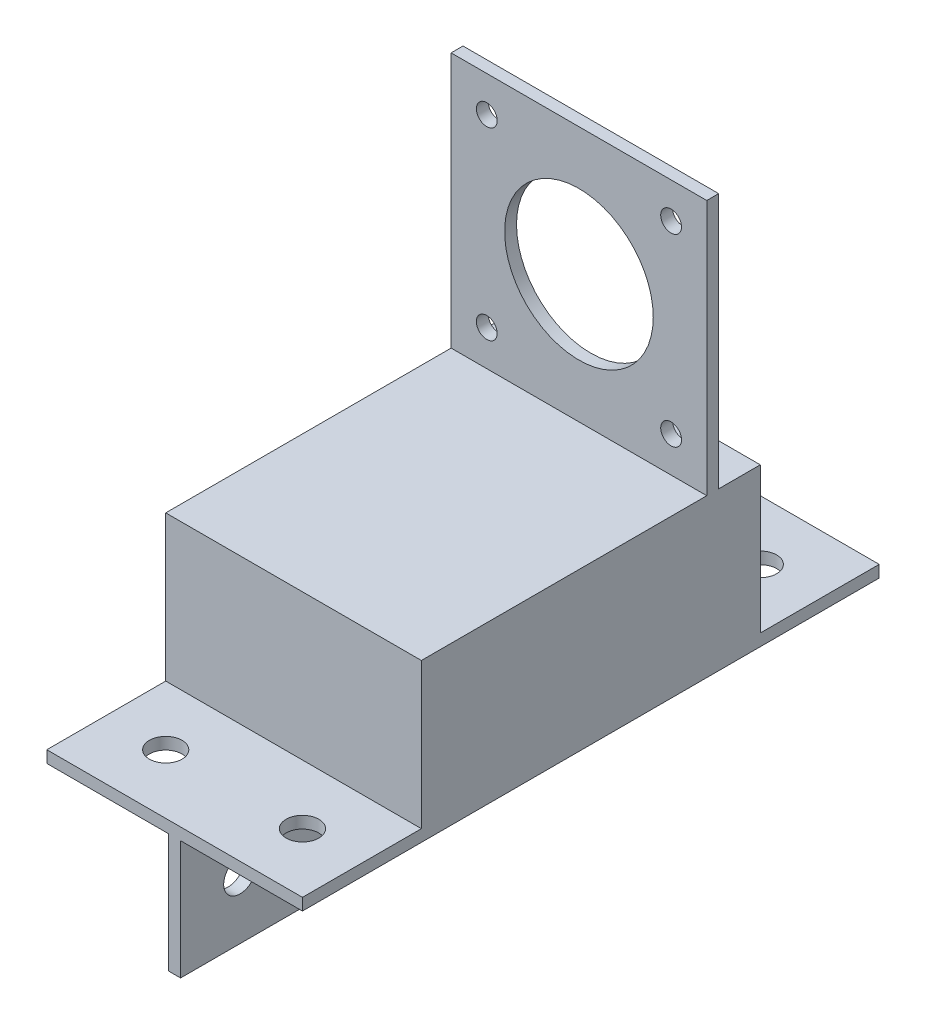
ISO-10303-21;
HEADER;
FILE_DESCRIPTION(('STEP AP214'),'2;1');
FILE_NAME('part.step','',(''),(''),'','','');
FILE_SCHEMA(('AUTOMOTIVE_DESIGN { 1 0 10303 214 1 1 1 1 }'));
ENDSEC;
DATA;
#1=APPLICATION_CONTEXT('core data for automotive mechanical design processes');
#2=APPLICATION_PROTOCOL_DEFINITION('international standard','automotive_design',2000,#1);
#3=PRODUCT_CONTEXT('',#1,'mechanical');
#4=PRODUCT('Part','Part','',(#3));
#5=PRODUCT_RELATED_PRODUCT_CATEGORY('part','',(#4));
#6=PRODUCT_DEFINITION_FORMATION('','',#4);
#7=PRODUCT_DEFINITION_CONTEXT('part definition',#1,'design');
#8=PRODUCT_DEFINITION('design','',#6,#7);
#9=PRODUCT_DEFINITION_SHAPE('','',#8);
#10=(LENGTH_UNIT() NAMED_UNIT(*) SI_UNIT(.MILLI.,.METRE.));
#11=(NAMED_UNIT(*) PLANE_ANGLE_UNIT() SI_UNIT($,.RADIAN.));
#12=(NAMED_UNIT(*) SI_UNIT($,.STERADIAN.) SOLID_ANGLE_UNIT());
#13=UNCERTAINTY_MEASURE_WITH_UNIT(LENGTH_MEASURE(1.E-05),#10,'distance_accuracy_value','');
#14=(GEOMETRIC_REPRESENTATION_CONTEXT(3) GLOBAL_UNCERTAINTY_ASSIGNED_CONTEXT((#13)) GLOBAL_UNIT_ASSIGNED_CONTEXT((#10,
#11,#12)) REPRESENTATION_CONTEXT('',''));
#15=CARTESIAN_POINT('',(0.,0.,0.));
#16=DIRECTION('',(0.,0.,1.));
#17=DIRECTION('',(1.,0.,0.));
#18=AXIS2_PLACEMENT_3D('',#15,#16,#17);
#19=CARTESIAN_POINT('',(0.,-26.5,0.));
#20=DIRECTION('',(0.,1.,0.));
#21=DIRECTION('',(0.,0.,1.));
#22=AXIS2_PLACEMENT_3D('',#19,#20,#21);
#23=PLANE('',#22);
#24=CARTESIAN_POINT('',(-11.5,-26.5,38.5));
#25=DIRECTION('',(0.,1.,0.));
#26=DIRECTION('',(0.,0.,1.));
#27=AXIS2_PLACEMENT_3D('',#24,#25,#26);
#28=CIRCLE('',#27,2.75);
#29=CARTESIAN_POINT('',(-11.5,-26.5,41.25));
#30=VERTEX_POINT('',#29);
#31=EDGE_CURVE('E224',#30,#30,#28,.F.);
#32=ORIENTED_EDGE('',*,*,#31,.F.);
#33=EDGE_LOOP('',(#32));
#34=FACE_BOUND('',#33,.T.);
#35=CARTESIAN_POINT('',(-11.5,-26.5,-38.5));
#36=DIRECTION('',(0.,1.,0.));
#37=DIRECTION('',(0.,0.,1.));
#38=AXIS2_PLACEMENT_3D('',#35,#36,#37);
#39=CIRCLE('',#38,2.75);
#40=CARTESIAN_POINT('',(-11.5,-26.5,-35.75));
#41=VERTEX_POINT('',#40);
#42=EDGE_CURVE('E220',#41,#41,#39,.F.);
#43=ORIENTED_EDGE('',*,*,#42,.F.);
#44=EDGE_LOOP('',(#43));
#45=FACE_BOUND('',#44,.T.);
#46=DIRECTION('',(0.,0.,-1.));
#47=VECTOR('',#46,1.);
#48=CARTESIAN_POINT('',(-0.999999999999987,-26.5,-48.5));
#49=LINE('',#48,#47);
#50=CARTESIAN_POINT('',(-0.999999999999987,-26.5,48.5));
#51=VERTEX_POINT('',#50);
#52=CARTESIAN_POINT('',(-0.999999999999987,-26.5,-48.5));
#53=VERTEX_POINT('',#52);
#54=EDGE_CURVE('E174',#51,#53,#49,.T.);
#55=ORIENTED_EDGE('',*,*,#54,.F.);
#56=DIRECTION('',(1.,0.,0.));
#57=VECTOR('',#56,1.);
#58=CARTESIAN_POINT('',(-21.5,-26.5,48.5));
#59=LINE('',#58,#57);
#60=CARTESIAN_POINT('',(-21.5,-26.5,48.5));
#61=VERTEX_POINT('',#60);
#62=EDGE_CURVE('E263',#61,#51,#59,.T.);
#63=ORIENTED_EDGE('',*,*,#62,.F.);
#64=DIRECTION('',(0.,0.,-1.));
#65=VECTOR('',#64,1.);
#66=CARTESIAN_POINT('',(-21.5,-26.5,48.5));
#67=LINE('',#66,#65);
#68=CARTESIAN_POINT('',(-21.5,-26.5,-48.5));
#69=VERTEX_POINT('',#68);
#70=EDGE_CURVE('E272',#61,#69,#67,.T.);
#71=ORIENTED_EDGE('',*,*,#70,.T.);
#72=DIRECTION('',(1.,0.,0.));
#73=VECTOR('',#72,1.);
#74=CARTESIAN_POINT('',(-21.5,-26.5,-48.5));
#75=LINE('',#74,#73);
#76=EDGE_CURVE('E62',#69,#53,#75,.T.);
#77=ORIENTED_EDGE('',*,*,#76,.T.);
#78=EDGE_LOOP('',(#55,#63,#71,#77));
#79=FACE_BOUND('',#78,.T.);
#80=ADVANCED_FACE('F37',(#34,#45,#79),#23,.F.);
#81=CARTESIAN_POINT('',(11.5,-26.5,-38.5));
#82=DIRECTION('',(0.,1.,0.));
#83=DIRECTION('',(0.,0.,1.));
#84=AXIS2_PLACEMENT_3D('',#81,#82,#83);
#85=CIRCLE('',#84,2.75);
#86=CARTESIAN_POINT('',(11.5,-26.5,-35.75));
#87=VERTEX_POINT('',#86);
#88=EDGE_CURVE('E225',#87,#87,#85,.F.);
#89=ORIENTED_EDGE('',*,*,#88,.F.);
#90=EDGE_LOOP('',(#89));
#91=FACE_BOUND('',#90,.T.);
#92=CARTESIAN_POINT('',(11.5,-26.5,38.5));
#93=DIRECTION('',(0.,1.,0.));
#94=DIRECTION('',(0.,0.,1.));
#95=AXIS2_PLACEMENT_3D('',#92,#93,#94);
#96=CIRCLE('',#95,2.75);
#97=CARTESIAN_POINT('',(11.5,-26.5,41.25));
#98=VERTEX_POINT('',#97);
#99=EDGE_CURVE('E221',#98,#98,#96,.F.);
#100=ORIENTED_EDGE('',*,*,#99,.F.);
#101=EDGE_LOOP('',(#100));
#102=FACE_BOUND('',#101,.T.);
#103=DIRECTION('',(0.,0.,1.));
#104=VECTOR('',#103,1.);
#105=CARTESIAN_POINT('',(1.00000000000001,-26.5,-48.5));
#106=LINE('',#105,#104);
#107=CARTESIAN_POINT('',(1.00000000000001,-26.5,-48.5));
#108=VERTEX_POINT('',#107);
#109=CARTESIAN_POINT('',(1.00000000000001,-26.5,48.5));
#110=VERTEX_POINT('',#109);
#111=EDGE_CURVE('E54',#108,#110,#106,.T.);
#112=ORIENTED_EDGE('',*,*,#111,.F.);
#113=CARTESIAN_POINT('',(21.5,-26.5,-48.5));
#114=VERTEX_POINT('',#113);
#115=EDGE_CURVE('E270',#108,#114,#75,.T.);
#116=ORIENTED_EDGE('',*,*,#115,.T.);
#117=DIRECTION('',(0.,0.,-1.));
#118=VECTOR('',#117,1.);
#119=CARTESIAN_POINT('',(21.5,-26.5,48.5));
#120=LINE('',#119,#118);
#121=CARTESIAN_POINT('',(21.5,-26.5,48.5));
#122=VERTEX_POINT('',#121);
#123=EDGE_CURVE('E266',#122,#114,#120,.T.);
#124=ORIENTED_EDGE('',*,*,#123,.F.);
#125=EDGE_CURVE('E267',#110,#122,#59,.T.);
#126=ORIENTED_EDGE('',*,*,#125,.F.);
#127=EDGE_LOOP('',(#112,#116,#124,#126));
#128=FACE_BOUND('',#127,.T.);
#129=ADVANCED_FACE('F335',(#91,#102,#128),#23,.F.);
#130=CARTESIAN_POINT('',(-21.5,-26.5,48.5));
#131=DIRECTION('',(0.,0.,1.));
#132=DIRECTION('',(1.,0.,0.));
#133=AXIS2_PLACEMENT_3D('',#130,#131,#132);
#134=PLANE('',#133);
#135=DIRECTION('',(0.,1.,0.));
#136=VECTOR('',#135,1.);
#137=CARTESIAN_POINT('',(21.5,-26.5,48.5));
#138=LINE('',#137,#136);
#139=CARTESIAN_POINT('',(21.5,-24.5,48.5));
#140=VERTEX_POINT('',#139);
#141=EDGE_CURVE('E274',#122,#140,#138,.T.);
#142=ORIENTED_EDGE('',*,*,#141,.T.);
#143=DIRECTION('',(1.,0.,0.));
#144=VECTOR('',#143,1.);
#145=CARTESIAN_POINT('',(21.5,-24.5,48.5));
#146=LINE('',#145,#144);
#147=CARTESIAN_POINT('',(-21.5,-24.5,48.5));
#148=VERTEX_POINT('',#147);
#149=EDGE_CURVE('E208',#148,#140,#146,.T.);
#150=ORIENTED_EDGE('',*,*,#149,.F.);
#151=DIRECTION('',(0.,1.,0.));
#152=VECTOR('',#151,1.);
#153=CARTESIAN_POINT('',(-21.5,-26.5,48.5));
#154=LINE('',#153,#152);
#155=EDGE_CURVE('E280',#61,#148,#154,.T.);
#156=ORIENTED_EDGE('',*,*,#155,.F.);
#157=ORIENTED_EDGE('',*,*,#62,.T.);
#158=DIRECTION('',(0.,1.,0.));
#159=VECTOR('',#158,1.);
#160=CARTESIAN_POINT('',(-0.999999999999987,-46.5,48.5));
#161=LINE('',#160,#159);
#162=CARTESIAN_POINT('',(-0.999999999999987,-46.5,48.5));
#163=VERTEX_POINT('',#162);
#164=EDGE_CURVE('E417',#163,#51,#161,.T.);
#165=ORIENTED_EDGE('',*,*,#164,.F.);
#166=DIRECTION('',(-1.,0.,0.));
#167=VECTOR('',#166,1.);
#168=CARTESIAN_POINT('',(-0.999999999999987,-46.5,48.5));
#169=LINE('',#168,#167);
#170=CARTESIAN_POINT('',(1.00000000000001,-46.5,48.5));
#171=VERTEX_POINT('',#170);
#172=EDGE_CURVE('E168',#171,#163,#169,.T.);
#173=ORIENTED_EDGE('',*,*,#172,.F.);
#174=DIRECTION('',(0.,1.,0.));
#175=VECTOR('',#174,1.);
#176=CARTESIAN_POINT('',(1.00000000000001,-46.5,48.5));
#177=LINE('',#176,#175);
#178=EDGE_CURVE('E179',#171,#110,#177,.T.);
#179=ORIENTED_EDGE('',*,*,#178,.T.);
#180=ORIENTED_EDGE('',*,*,#125,.T.);
#181=EDGE_LOOP('',(#142,#150,#156,#157,#165,#173,#179,#180));
#182=FACE_BOUND('',#181,.T.);
#183=ADVANCED_FACE('F329',(#182),#134,.T.);
#184=CARTESIAN_POINT('',(-11.5,-26.501,38.5));
#185=DIRECTION('',(0.,1.,0.));
#186=DIRECTION('',(0.,0.,1.));
#187=AXIS2_PLACEMENT_3D('',#184,#185,#186);
#188=CYLINDRICAL_SURFACE('',#187,2.75);
#189=ORIENTED_EDGE('',*,*,#31,.T.);
#190=EDGE_LOOP('',(#189));
#191=FACE_BOUND('',#190,.T.);
#192=CARTESIAN_POINT('',(-11.5,-24.5,38.5));
#193=DIRECTION('',(0.,1.,0.));
#194=DIRECTION('',(0.,0.,1.));
#195=AXIS2_PLACEMENT_3D('',#192,#193,#194);
#196=CIRCLE('',#195,2.75);
#197=CARTESIAN_POINT('',(-11.5,-24.5,41.25));
#198=VERTEX_POINT('',#197);
#199=EDGE_CURVE('E217',#198,#198,#196,.F.);
#200=ORIENTED_EDGE('',*,*,#199,.F.);
#201=EDGE_LOOP('',(#200));
#202=FACE_BOUND('',#201,.T.);
#203=ADVANCED_FACE('F320',(#191,#202),#188,.F.);
#204=CARTESIAN_POINT('',(11.5,-26.501,38.5));
#205=DIRECTION('',(0.,1.,0.));
#206=DIRECTION('',(0.,0.,1.));
#207=AXIS2_PLACEMENT_3D('',#204,#205,#206);
#208=CYLINDRICAL_SURFACE('',#207,2.75);
#209=ORIENTED_EDGE('',*,*,#99,.T.);
#210=EDGE_LOOP('',(#209));
#211=FACE_BOUND('',#210,.T.);
#212=CARTESIAN_POINT('',(11.5,-24.5,38.5));
#213=DIRECTION('',(0.,1.,0.));
#214=DIRECTION('',(0.,0.,1.));
#215=AXIS2_PLACEMENT_3D('',#212,#213,#214);
#216=CIRCLE('',#215,2.75);
#217=CARTESIAN_POINT('',(11.5,-24.5,41.25));
#218=VERTEX_POINT('',#217);
#219=EDGE_CURVE('E215',#218,#218,#216,.F.);
#220=ORIENTED_EDGE('',*,*,#219,.F.);
#221=EDGE_LOOP('',(#220));
#222=FACE_BOUND('',#221,.T.);
#223=ADVANCED_FACE('F318',(#211,#222),#208,.F.);
#224=CARTESIAN_POINT('',(-21.5,43.,0.));
#225=DIRECTION('',(-1.,0.,0.));
#226=DIRECTION('',(0.,0.,1.));
#227=AXIS2_PLACEMENT_3D('',#224,#225,#226);
#228=PLANE('',#227);
#229=DIRECTION('',(0.,1.,0.));
#230=VECTOR('',#229,1.);
#231=CARTESIAN_POINT('',(-21.5,-24.5,-28.5));
#232=LINE('',#231,#230);
#233=CARTESIAN_POINT('',(-21.5,-24.5,-28.5));
#234=VERTEX_POINT('',#233);
#235=CARTESIAN_POINT('',(-21.5,0.,-28.5));
#236=VERTEX_POINT('',#235);
#237=EDGE_CURVE('E190',#234,#236,#232,.T.);
#238=ORIENTED_EDGE('',*,*,#237,.F.);
#239=DIRECTION('',(0.,0.,1.));
#240=VECTOR('',#239,1.);
#241=CARTESIAN_POINT('',(-21.5,-24.5,-48.5));
#242=LINE('',#241,#240);
#243=CARTESIAN_POINT('',(-21.5,-24.5,-48.5));
#244=VERTEX_POINT('',#243);
#245=EDGE_CURVE('E186',#244,#234,#242,.T.);
#246=ORIENTED_EDGE('',*,*,#245,.F.);
#247=DIRECTION('',(0.,1.,0.));
#248=VECTOR('',#247,1.);
#249=CARTESIAN_POINT('',(-21.5,-26.5,-48.5));
#250=LINE('',#249,#248);
#251=EDGE_CURVE('E284',#69,#244,#250,.T.);
#252=ORIENTED_EDGE('',*,*,#251,.F.);
#253=ORIENTED_EDGE('',*,*,#70,.F.);
#254=ORIENTED_EDGE('',*,*,#155,.T.);
#255=DIRECTION('',(0.,0.,1.));
#256=VECTOR('',#255,1.);
#257=CARTESIAN_POINT('',(-21.5,-24.5,48.5));
#258=LINE('',#257,#256);
#259=CARTESIAN_POINT('',(-21.5,-24.5,28.5));
#260=VERTEX_POINT('',#259);
#261=EDGE_CURVE('E206',#260,#148,#258,.T.);
#262=ORIENTED_EDGE('',*,*,#261,.F.);
#263=DIRECTION('',(0.,1.,0.));
#264=VECTOR('',#263,1.);
#265=CARTESIAN_POINT('',(-21.5,-24.5,28.5));
#266=LINE('',#265,#264);
#267=CARTESIAN_POINT('',(-21.5,0.,28.5));
#268=VERTEX_POINT('',#267);
#269=EDGE_CURVE('E212',#260,#268,#266,.T.);
#270=ORIENTED_EDGE('',*,*,#269,.T.);
#271=DIRECTION('',(0.,0.,-1.));
#272=VECTOR('',#271,1.);
#273=CARTESIAN_POINT('',(-21.5,0.,48.5));
#274=LINE('',#273,#272);
#275=CARTESIAN_POINT('',(-21.5,0.,-19.5));
#276=VERTEX_POINT('',#275);
#277=EDGE_CURVE('E278',#268,#276,#274,.T.);
#278=ORIENTED_EDGE('',*,*,#277,.T.);
#279=DIRECTION('',(0.,-1.,0.));
#280=VECTOR('',#279,1.);
#281=CARTESIAN_POINT('',(-21.5,43.,-19.5));
#282=LINE('',#281,#280);
#283=CARTESIAN_POINT('',(-21.5,43.,-19.5));
#284=VERTEX_POINT('',#283);
#285=EDGE_CURVE('E11',#284,#276,#282,.T.);
#286=ORIENTED_EDGE('',*,*,#285,.F.);
#287=DIRECTION('',(0.,0.,-1.));
#288=VECTOR('',#287,1.);
#289=CARTESIAN_POINT('',(-21.5,43.,0.));
#290=LINE('',#289,#288);
#291=CARTESIAN_POINT('',(-21.5,43.,-21.5));
#292=VERTEX_POINT('',#291);
#293=EDGE_CURVE('E291',#284,#292,#290,.T.);
#294=ORIENTED_EDGE('',*,*,#293,.T.);
#295=DIRECTION('',(0.,-1.,0.));
#296=VECTOR('',#295,1.);
#297=CARTESIAN_POINT('',(-21.5,43.,-21.5));
#298=LINE('',#297,#296);
#299=CARTESIAN_POINT('',(-21.5,0.,-21.5));
#300=VERTEX_POINT('',#299);
#301=EDGE_CURVE('E302',#292,#300,#298,.T.);
#302=ORIENTED_EDGE('',*,*,#301,.T.);
#303=EDGE_CURVE('E277',#300,#236,#274,.T.);
#304=ORIENTED_EDGE('',*,*,#303,.T.);
#305=EDGE_LOOP('',(#238,#246,#252,#253,#254,#262,#270,#278,#286,#294,#302,#304));
#306=FACE_BOUND('',#305,.T.);
#307=ADVANCED_FACE('F39',(#306),#228,.T.);
#308=CARTESIAN_POINT('',(0.,43.,-19.5));
#309=DIRECTION('',(0.,0.,-1.));
#310=DIRECTION('',(-1.,0.,0.));
#311=AXIS2_PLACEMENT_3D('',#308,#309,#310);
#312=PLANE('',#311);
#313=CARTESIAN_POINT('',(15.5000000000001,37.0000000000004,-19.5));
#314=DIRECTION('',(0.,0.,1.));
#315=DIRECTION('',(1.,0.,0.));
#316=AXIS2_PLACEMENT_3D('',#313,#314,#315);
#317=CIRCLE('',#316,1.75);
#318=CARTESIAN_POINT('',(17.2500000000001,37.0000000000004,-19.5));
#319=VERTEX_POINT('',#318);
#320=EDGE_CURVE('E232',#319,#319,#317,.T.);
#321=ORIENTED_EDGE('',*,*,#320,.F.);
#322=EDGE_LOOP('',(#321));
#323=FACE_BOUND('',#322,.T.);
#324=CARTESIAN_POINT('',(-15.4999999999996,5.99999999999993,-19.5));
#325=DIRECTION('',(0.,0.,1.));
#326=DIRECTION('',(1.,0.,0.));
#327=AXIS2_PLACEMENT_3D('',#324,#325,#326);
#328=CIRCLE('',#327,1.75);
#329=CARTESIAN_POINT('',(-13.7499999999996,5.99999999999993,-19.5));
#330=VERTEX_POINT('',#329);
#331=EDGE_CURVE('E237',#330,#330,#328,.T.);
#332=ORIENTED_EDGE('',*,*,#331,.F.);
#333=EDGE_LOOP('',(#332));
#334=FACE_BOUND('',#333,.T.);
#335=CARTESIAN_POINT('',(15.5000000000004,6.00000000000031,-19.5));
#336=DIRECTION('',(0.,0.,1.));
#337=DIRECTION('',(1.,0.,0.));
#338=AXIS2_PLACEMENT_3D('',#335,#336,#337);
#339=CIRCLE('',#338,1.75);
#340=CARTESIAN_POINT('',(17.2500000000004,6.00000000000031,-19.5));
#341=VERTEX_POINT('',#340);
#342=EDGE_CURVE('E236',#341,#341,#339,.T.);
#343=ORIENTED_EDGE('',*,*,#342,.F.);
#344=EDGE_LOOP('',(#343));
#345=FACE_BOUND('',#344,.T.);
#346=CARTESIAN_POINT('',(-15.5,37.,-19.5));
#347=DIRECTION('',(0.,0.,1.));
#348=DIRECTION('',(1.,0.,0.));
#349=AXIS2_PLACEMENT_3D('',#346,#347,#348);
#350=CIRCLE('',#349,1.75);
#351=CARTESIAN_POINT('',(-13.75,37.,-19.5));
#352=VERTEX_POINT('',#351);
#353=EDGE_CURVE('E249',#352,#352,#350,.T.);
#354=ORIENTED_EDGE('',*,*,#353,.F.);
#355=EDGE_LOOP('',(#354));
#356=FACE_BOUND('',#355,.T.);
#357=CARTESIAN_POINT('',(0.,21.5,-19.5));
#358=DIRECTION('',(0.,0.,1.));
#359=DIRECTION('',(1.,0.,0.));
#360=AXIS2_PLACEMENT_3D('',#357,#358,#359);
#361=CIRCLE('',#360,12.5);
#362=CARTESIAN_POINT('',(12.5,21.5,-19.5));
#363=VERTEX_POINT('',#362);
#364=EDGE_CURVE('E257',#363,#363,#361,.T.);
#365=ORIENTED_EDGE('',*,*,#364,.F.);
#366=EDGE_LOOP('',(#365));
#367=FACE_BOUND('',#366,.T.);
#368=DIRECTION('',(1.,0.,0.));
#369=VECTOR('',#368,1.);
#370=CARTESIAN_POINT('',(0.,0.,-19.5));
#371=LINE('',#370,#369);
#372=CARTESIAN_POINT('',(21.5,0.,-19.5));
#373=VERTEX_POINT('',#372);
#374=EDGE_CURVE('E283',#276,#373,#371,.T.);
#375=ORIENTED_EDGE('',*,*,#374,.T.);
#376=DIRECTION('',(0.,-1.,0.));
#377=VECTOR('',#376,1.);
#378=CARTESIAN_POINT('',(21.5,43.,-19.5));
#379=LINE('',#378,#377);
#380=CARTESIAN_POINT('',(21.5,43.,-19.5));
#381=VERTEX_POINT('',#380);
#382=EDGE_CURVE('E46',#381,#373,#379,.T.);
#383=ORIENTED_EDGE('',*,*,#382,.F.);
#384=DIRECTION('',(1.,0.,0.));
#385=VECTOR('',#384,1.);
#386=CARTESIAN_POINT('',(0.,43.,-19.5));
#387=LINE('',#386,#385);
#388=EDGE_CURVE('E294',#284,#381,#387,.T.);
#389=ORIENTED_EDGE('',*,*,#388,.F.);
#390=ORIENTED_EDGE('',*,*,#285,.T.);
#391=EDGE_LOOP('',(#375,#383,#389,#390));
#392=FACE_BOUND('',#391,.T.);
#393=ADVANCED_FACE('F327',(#323,#334,#345,#356,#367,#392),#312,.F.);
#394=CARTESIAN_POINT('',(21.5,43.,0.));
#395=DIRECTION('',(-1.,0.,0.));
#396=DIRECTION('',(0.,0.,1.));
#397=AXIS2_PLACEMENT_3D('',#394,#395,#396);
#398=PLANE('',#397);
#399=DIRECTION('',(0.,0.,-1.));
#400=VECTOR('',#399,1.);
#401=CARTESIAN_POINT('',(21.5,-24.5,-48.5));
#402=LINE('',#401,#400);
#403=CARTESIAN_POINT('',(21.5,-24.5,-28.5));
#404=VERTEX_POINT('',#403);
#405=CARTESIAN_POINT('',(21.5,-24.5,-48.5));
#406=VERTEX_POINT('',#405);
#407=EDGE_CURVE('E177',#404,#406,#402,.T.);
#408=ORIENTED_EDGE('',*,*,#407,.F.);
#409=DIRECTION('',(0.,1.,0.));
#410=VECTOR('',#409,1.);
#411=CARTESIAN_POINT('',(21.5,-24.5,-28.5));
#412=LINE('',#411,#410);
#413=CARTESIAN_POINT('',(21.5,0.,-28.5));
#414=VERTEX_POINT('',#413);
#415=EDGE_CURVE('E192',#404,#414,#412,.T.);
#416=ORIENTED_EDGE('',*,*,#415,.T.);
#417=DIRECTION('',(0.,0.,-1.));
#418=VECTOR('',#417,1.);
#419=CARTESIAN_POINT('',(21.5,0.,48.5));
#420=LINE('',#419,#418);
#421=CARTESIAN_POINT('',(21.5,0.,-21.5));
#422=VERTEX_POINT('',#421);
#423=EDGE_CURVE('E260',#422,#414,#420,.T.);
#424=ORIENTED_EDGE('',*,*,#423,.F.);
#425=DIRECTION('',(0.,-1.,0.));
#426=VECTOR('',#425,1.);
#427=CARTESIAN_POINT('',(21.5,43.,-21.5));
#428=LINE('',#427,#426);
#429=CARTESIAN_POINT('',(21.5,43.,-21.5));
#430=VERTEX_POINT('',#429);
#431=EDGE_CURVE('E308',#430,#422,#428,.T.);
#432=ORIENTED_EDGE('',*,*,#431,.F.);
#433=DIRECTION('',(0.,0.,-1.));
#434=VECTOR('',#433,1.);
#435=CARTESIAN_POINT('',(21.5,43.,0.));
#436=LINE('',#435,#434);
#437=EDGE_CURVE('E297',#381,#430,#436,.T.);
#438=ORIENTED_EDGE('',*,*,#437,.F.);
#439=ORIENTED_EDGE('',*,*,#382,.T.);
#440=CARTESIAN_POINT('',(21.5,0.,28.5));
#441=VERTEX_POINT('',#440);
#442=EDGE_CURVE('E275',#441,#373,#420,.T.);
#443=ORIENTED_EDGE('',*,*,#442,.F.);
#444=DIRECTION('',(0.,1.,0.));
#445=VECTOR('',#444,1.);
#446=CARTESIAN_POINT('',(21.5,-24.5,28.5));
#447=LINE('',#446,#445);
#448=CARTESIAN_POINT('',(21.5,-24.5,28.5));
#449=VERTEX_POINT('',#448);
#450=EDGE_CURVE('E210',#449,#441,#447,.T.);
#451=ORIENTED_EDGE('',*,*,#450,.F.);
#452=DIRECTION('',(0.,0.,-1.));
#453=VECTOR('',#452,1.);
#454=CARTESIAN_POINT('',(21.5,-24.5,48.5));
#455=LINE('',#454,#453);
#456=EDGE_CURVE('E200',#140,#449,#455,.T.);
#457=ORIENTED_EDGE('',*,*,#456,.F.);
#458=ORIENTED_EDGE('',*,*,#141,.F.);
#459=ORIENTED_EDGE('',*,*,#123,.T.);
#460=DIRECTION('',(0.,1.,0.));
#461=VECTOR('',#460,1.);
#462=CARTESIAN_POINT('',(21.5,-26.5,-48.5));
#463=LINE('',#462,#461);
#464=EDGE_CURVE('E286',#114,#406,#463,.T.);
#465=ORIENTED_EDGE('',*,*,#464,.T.);
#466=EDGE_LOOP('',(#408,#416,#424,#432,#438,#439,#443,#451,#457,#458,#459,#465));
#467=FACE_BOUND('',#466,.T.);
#468=ADVANCED_FACE('F365',(#467),#398,.F.);
#469=CARTESIAN_POINT('',(0.,43.,-21.5));
#470=DIRECTION('',(0.,0.,-1.));
#471=DIRECTION('',(-1.,0.,0.));
#472=AXIS2_PLACEMENT_3D('',#469,#470,#471);
#473=PLANE('',#472);
#474=CARTESIAN_POINT('',(15.5000000000001,37.0000000000004,-21.5));
#475=DIRECTION('',(0.,0.,-1.));
#476=DIRECTION('',(-1.,0.,0.));
#477=AXIS2_PLACEMENT_3D('',#474,#475,#476);
#478=CIRCLE('',#477,1.75);
#479=CARTESIAN_POINT('',(13.7500000000001,37.0000000000004,-21.5));
#480=VERTEX_POINT('',#479);
#481=EDGE_CURVE('E240',#480,#480,#478,.F.);
#482=ORIENTED_EDGE('',*,*,#481,.T.);
#483=EDGE_LOOP('',(#482));
#484=FACE_BOUND('',#483,.T.);
#485=CARTESIAN_POINT('',(-15.4999999999996,5.99999999999993,-21.5));
#486=DIRECTION('',(0.,0.,-1.));
#487=DIRECTION('',(-1.,0.,0.));
#488=AXIS2_PLACEMENT_3D('',#485,#486,#487);
#489=CIRCLE('',#488,1.75);
#490=CARTESIAN_POINT('',(-17.2499999999996,5.99999999999993,-21.5));
#491=VERTEX_POINT('',#490);
#492=EDGE_CURVE('E233',#491,#491,#489,.F.);
#493=ORIENTED_EDGE('',*,*,#492,.T.);
#494=EDGE_LOOP('',(#493));
#495=FACE_BOUND('',#494,.T.);
#496=CARTESIAN_POINT('',(15.5000000000004,6.00000000000031,-21.5));
#497=DIRECTION('',(0.,0.,-1.));
#498=DIRECTION('',(-1.,0.,0.));
#499=AXIS2_PLACEMENT_3D('',#496,#497,#498);
#500=CIRCLE('',#499,1.75);
#501=CARTESIAN_POINT('',(13.7500000000004,6.00000000000031,-21.5));
#502=VERTEX_POINT('',#501);
#503=EDGE_CURVE('E252',#502,#502,#500,.F.);
#504=ORIENTED_EDGE('',*,*,#503,.T.);
#505=EDGE_LOOP('',(#504));
#506=FACE_BOUND('',#505,.T.);
#507=CARTESIAN_POINT('',(-15.5,37.,-21.5));
#508=DIRECTION('',(0.,0.,-1.));
#509=DIRECTION('',(-1.,0.,0.));
#510=AXIS2_PLACEMENT_3D('',#507,#508,#509);
#511=CIRCLE('',#510,1.75);
#512=CARTESIAN_POINT('',(-17.25,37.,-21.5));
#513=VERTEX_POINT('',#512);
#514=EDGE_CURVE('E245',#513,#513,#511,.F.);
#515=ORIENTED_EDGE('',*,*,#514,.T.);
#516=EDGE_LOOP('',(#515));
#517=FACE_BOUND('',#516,.T.);
#518=CARTESIAN_POINT('',(0.,21.5,-21.5));
#519=DIRECTION('',(0.,0.,-1.));
#520=DIRECTION('',(-1.,0.,0.));
#521=AXIS2_PLACEMENT_3D('',#518,#519,#520);
#522=CIRCLE('',#521,12.5);
#523=CARTESIAN_POINT('',(-12.5,21.5,-21.5));
#524=VERTEX_POINT('',#523);
#525=EDGE_CURVE('E248',#524,#524,#522,.F.);
#526=ORIENTED_EDGE('',*,*,#525,.T.);
#527=EDGE_LOOP('',(#526));
#528=FACE_BOUND('',#527,.T.);
#529=DIRECTION('',(1.,0.,0.));
#530=VECTOR('',#529,1.);
#531=CARTESIAN_POINT('',(0.,0.,-21.5));
#532=LINE('',#531,#530);
#533=EDGE_CURVE('E295',#300,#422,#532,.T.);
#534=ORIENTED_EDGE('',*,*,#533,.F.);
#535=ORIENTED_EDGE('',*,*,#301,.F.);
#536=DIRECTION('',(1.,0.,0.));
#537=VECTOR('',#536,1.);
#538=CARTESIAN_POINT('',(0.,43.,-21.5));
#539=LINE('',#538,#537);
#540=EDGE_CURVE('E299',#292,#430,#539,.T.);
#541=ORIENTED_EDGE('',*,*,#540,.T.);
#542=ORIENTED_EDGE('',*,*,#431,.T.);
#543=EDGE_LOOP('',(#534,#535,#541,#542));
#544=FACE_BOUND('',#543,.T.);
#545=ADVANCED_FACE('F361',(#484,#495,#506,#517,#528,#544),#473,.T.);
#546=CARTESIAN_POINT('',(0.,43.,0.));
#547=DIRECTION('',(0.,1.,0.));
#548=DIRECTION('',(0.,0.,1.));
#549=AXIS2_PLACEMENT_3D('',#546,#547,#548);
#550=PLANE('',#549);
#551=ORIENTED_EDGE('',*,*,#293,.F.);
#552=ORIENTED_EDGE('',*,*,#388,.T.);
#553=ORIENTED_EDGE('',*,*,#437,.T.);
#554=ORIENTED_EDGE('',*,*,#540,.F.);
#555=EDGE_LOOP('',(#551,#552,#553,#554));
#556=FACE_BOUND('',#555,.T.);
#557=ADVANCED_FACE('F358',(#556),#550,.T.);
#558=CARTESIAN_POINT('',(0.,0.,0.));
#559=DIRECTION('',(0.,1.,0.));
#560=DIRECTION('',(0.,0.,1.));
#561=AXIS2_PLACEMENT_3D('',#558,#559,#560);
#562=PLANE('',#561);
#563=DIRECTION('',(-1.,0.,0.));
#564=VECTOR('',#563,1.);
#565=CARTESIAN_POINT('',(21.5,0.,28.5));
#566=LINE('',#565,#564);
#567=EDGE_CURVE('E199',#441,#268,#566,.T.);
#568=ORIENTED_EDGE('',*,*,#567,.F.);
#569=ORIENTED_EDGE('',*,*,#442,.T.);
#570=ORIENTED_EDGE('',*,*,#374,.F.);
#571=ORIENTED_EDGE('',*,*,#277,.F.);
#572=EDGE_LOOP('',(#568,#569,#570,#571));
#573=FACE_BOUND('',#572,.T.);
#574=ADVANCED_FACE('F352',(#573),#562,.T.);
#575=CARTESIAN_POINT('',(-21.5,-26.5,-48.5));
#576=DIRECTION('',(0.,0.,1.));
#577=DIRECTION('',(1.,0.,0.));
#578=AXIS2_PLACEMENT_3D('',#575,#576,#577);
#579=PLANE('',#578);
#580=ORIENTED_EDGE('',*,*,#251,.T.);
#581=DIRECTION('',(-1.,0.,0.));
#582=VECTOR('',#581,1.);
#583=CARTESIAN_POINT('',(21.5,-24.5,-48.5));
#584=LINE('',#583,#582);
#585=EDGE_CURVE('E184',#406,#244,#584,.T.);
#586=ORIENTED_EDGE('',*,*,#585,.F.);
#587=ORIENTED_EDGE('',*,*,#464,.F.);
#588=ORIENTED_EDGE('',*,*,#115,.F.);
#589=DIRECTION('',(0.,1.,0.));
#590=VECTOR('',#589,1.);
#591=CARTESIAN_POINT('',(1.00000000000001,-46.5,-48.5));
#592=LINE('',#591,#590);
#593=CARTESIAN_POINT('',(1.00000000000001,-46.5,-48.5));
#594=VERTEX_POINT('',#593);
#595=EDGE_CURVE('E159',#594,#108,#592,.T.);
#596=ORIENTED_EDGE('',*,*,#595,.F.);
#597=DIRECTION('',(1.,0.,0.));
#598=VECTOR('',#597,1.);
#599=CARTESIAN_POINT('',(-0.999999999999987,-46.5,-48.5));
#600=LINE('',#599,#598);
#601=CARTESIAN_POINT('',(-0.999999999999987,-46.5,-48.5));
#602=VERTEX_POINT('',#601);
#603=EDGE_CURVE('E151',#602,#594,#600,.T.);
#604=ORIENTED_EDGE('',*,*,#603,.F.);
#605=DIRECTION('',(0.,1.,0.));
#606=VECTOR('',#605,1.);
#607=CARTESIAN_POINT('',(-0.999999999999987,-46.5,-48.5));
#608=LINE('',#607,#606);
#609=EDGE_CURVE('E156',#602,#53,#608,.T.);
#610=ORIENTED_EDGE('',*,*,#609,.T.);
#611=ORIENTED_EDGE('',*,*,#76,.F.);
#612=EDGE_LOOP('',(#580,#586,#587,#588,#596,#604,#610,#611));
#613=FACE_BOUND('',#612,.T.);
#614=ADVANCED_FACE('F154',(#613),#579,.F.);
#615=DIRECTION('',(1.,0.,0.));
#616=VECTOR('',#615,1.);
#617=CARTESIAN_POINT('',(21.5,0.,-28.5));
#618=LINE('',#617,#616);
#619=EDGE_CURVE('E175',#236,#414,#618,.T.);
#620=ORIENTED_EDGE('',*,*,#619,.F.);
#621=ORIENTED_EDGE('',*,*,#303,.F.);
#622=ORIENTED_EDGE('',*,*,#533,.T.);
#623=ORIENTED_EDGE('',*,*,#423,.T.);
#624=EDGE_LOOP('',(#620,#621,#622,#623));
#625=FACE_BOUND('',#624,.T.);
#626=ADVANCED_FACE('F348',(#625),#562,.T.);
#627=CARTESIAN_POINT('',(0.,21.5,-48.501));
#628=DIRECTION('',(0.,0.,1.));
#629=DIRECTION('',(1.,0.,0.));
#630=AXIS2_PLACEMENT_3D('',#627,#628,#629);
#631=CYLINDRICAL_SURFACE('',#630,12.5);
#632=ORIENTED_EDGE('',*,*,#525,.F.);
#633=EDGE_LOOP('',(#632));
#634=FACE_BOUND('',#633,.T.);
#635=ORIENTED_EDGE('',*,*,#364,.T.);
#636=EDGE_LOOP('',(#635));
#637=FACE_BOUND('',#636,.T.);
#638=ADVANCED_FACE('F346',(#634,#637),#631,.F.);
#639=CARTESIAN_POINT('',(-15.5,37.,-48.501));
#640=DIRECTION('',(0.,0.,1.));
#641=DIRECTION('',(1.,0.,0.));
#642=AXIS2_PLACEMENT_3D('',#639,#640,#641);
#643=CYLINDRICAL_SURFACE('',#642,1.75);
#644=ORIENTED_EDGE('',*,*,#514,.F.);
#645=EDGE_LOOP('',(#644));
#646=FACE_BOUND('',#645,.T.);
#647=ORIENTED_EDGE('',*,*,#353,.T.);
#648=EDGE_LOOP('',(#647));
#649=FACE_BOUND('',#648,.T.);
#650=ADVANCED_FACE('F549',(#646,#649),#643,.F.);
#651=CARTESIAN_POINT('',(15.5000000000004,6.00000000000031,-48.501));
#652=DIRECTION('',(0.,0.,1.));
#653=DIRECTION('',(1.,0.,0.));
#654=AXIS2_PLACEMENT_3D('',#651,#652,#653);
#655=CYLINDRICAL_SURFACE('',#654,1.75);
#656=ORIENTED_EDGE('',*,*,#503,.F.);
#657=EDGE_LOOP('',(#656));
#658=FACE_BOUND('',#657,.T.);
#659=ORIENTED_EDGE('',*,*,#342,.T.);
#660=EDGE_LOOP('',(#659));
#661=FACE_BOUND('',#660,.T.);
#662=ADVANCED_FACE('F557',(#658,#661),#655,.F.);
#663=CARTESIAN_POINT('',(-15.4999999999996,5.99999999999993,-48.501));
#664=DIRECTION('',(0.,0.,1.));
#665=DIRECTION('',(1.,0.,0.));
#666=AXIS2_PLACEMENT_3D('',#663,#664,#665);
#667=CYLINDRICAL_SURFACE('',#666,1.75);
#668=ORIENTED_EDGE('',*,*,#492,.F.);
#669=EDGE_LOOP('',(#668));
#670=FACE_BOUND('',#669,.T.);
#671=ORIENTED_EDGE('',*,*,#331,.T.);
#672=EDGE_LOOP('',(#671));
#673=FACE_BOUND('',#672,.T.);
#674=ADVANCED_FACE('F565',(#670,#673),#667,.F.);
#675=CARTESIAN_POINT('',(15.5000000000001,37.0000000000004,-48.501));
#676=DIRECTION('',(0.,0.,1.));
#677=DIRECTION('',(1.,0.,0.));
#678=AXIS2_PLACEMENT_3D('',#675,#676,#677);
#679=CYLINDRICAL_SURFACE('',#678,1.75);
#680=ORIENTED_EDGE('',*,*,#481,.F.);
#681=EDGE_LOOP('',(#680));
#682=FACE_BOUND('',#681,.T.);
#683=ORIENTED_EDGE('',*,*,#320,.T.);
#684=EDGE_LOOP('',(#683));
#685=FACE_BOUND('',#684,.T.);
#686=ADVANCED_FACE('F572',(#682,#685),#679,.F.);
#687=CARTESIAN_POINT('',(-11.5,-26.501,-38.5));
#688=DIRECTION('',(0.,1.,0.));
#689=DIRECTION('',(0.,0.,1.));
#690=AXIS2_PLACEMENT_3D('',#687,#688,#689);
#691=CYLINDRICAL_SURFACE('',#690,2.75);
#692=CARTESIAN_POINT('',(-11.5,-24.5,-38.5));
#693=DIRECTION('',(0.,-1.,0.));
#694=DIRECTION('',(0.,0.,-1.));
#695=AXIS2_PLACEMENT_3D('',#692,#693,#694);
#696=CIRCLE('',#695,2.75);
#697=CARTESIAN_POINT('',(-11.5,-24.5,-41.25));
#698=VERTEX_POINT('',#697);
#699=EDGE_CURVE('E196',#698,#698,#696,.F.);
#700=ORIENTED_EDGE('',*,*,#699,.T.);
#701=EDGE_LOOP('',(#700));
#702=FACE_BOUND('',#701,.T.);
#703=ORIENTED_EDGE('',*,*,#42,.T.);
#704=EDGE_LOOP('',(#703));
#705=FACE_BOUND('',#704,.T.);
#706=ADVANCED_FACE('F580',(#702,#705),#691,.F.);
#707=CARTESIAN_POINT('',(11.5,-26.501,-38.5));
#708=DIRECTION('',(0.,1.,0.));
#709=DIRECTION('',(0.,0.,1.));
#710=AXIS2_PLACEMENT_3D('',#707,#708,#709);
#711=CYLINDRICAL_SURFACE('',#710,2.75);
#712=CARTESIAN_POINT('',(11.5,-24.5,-38.5));
#713=DIRECTION('',(0.,-1.,0.));
#714=DIRECTION('',(0.,0.,-1.));
#715=AXIS2_PLACEMENT_3D('',#712,#713,#714);
#716=CIRCLE('',#715,2.75);
#717=CARTESIAN_POINT('',(11.5,-24.5,-41.25));
#718=VERTEX_POINT('',#717);
#719=EDGE_CURVE('E41',#718,#718,#716,.F.);
#720=ORIENTED_EDGE('',*,*,#719,.T.);
#721=EDGE_LOOP('',(#720));
#722=FACE_BOUND('',#721,.T.);
#723=ORIENTED_EDGE('',*,*,#88,.T.);
#724=EDGE_LOOP('',(#723));
#725=FACE_BOUND('',#724,.T.);
#726=ADVANCED_FACE('F463',(#722,#725),#711,.F.);
#727=CARTESIAN_POINT('',(0.,-24.5,0.));
#728=DIRECTION('',(0.,1.,0.));
#729=DIRECTION('',(0.,0.,1.));
#730=AXIS2_PLACEMENT_3D('',#727,#728,#729);
#731=PLANE('',#730);
#732=ORIENTED_EDGE('',*,*,#456,.T.);
#733=DIRECTION('',(-1.,0.,0.));
#734=VECTOR('',#733,1.);
#735=CARTESIAN_POINT('',(21.5,-24.5,28.5));
#736=LINE('',#735,#734);
#737=EDGE_CURVE('E203',#449,#260,#736,.T.);
#738=ORIENTED_EDGE('',*,*,#737,.T.);
#739=ORIENTED_EDGE('',*,*,#261,.T.);
#740=ORIENTED_EDGE('',*,*,#149,.T.);
#741=EDGE_LOOP('',(#732,#738,#739,#740));
#742=FACE_BOUND('',#741,.T.);
#743=ORIENTED_EDGE('',*,*,#219,.T.);
#744=EDGE_LOOP('',(#743));
#745=FACE_BOUND('',#744,.T.);
#746=ORIENTED_EDGE('',*,*,#199,.T.);
#747=EDGE_LOOP('',(#746));
#748=FACE_BOUND('',#747,.T.);
#749=ADVANCED_FACE('F315',(#742,#745,#748),#731,.T.);
#750=CARTESIAN_POINT('',(21.5,-24.5,28.5));
#751=DIRECTION('',(0.,0.,-1.));
#752=DIRECTION('',(-1.,0.,0.));
#753=AXIS2_PLACEMENT_3D('',#750,#751,#752);
#754=PLANE('',#753);
#755=ORIENTED_EDGE('',*,*,#567,.T.);
#756=ORIENTED_EDGE('',*,*,#269,.F.);
#757=ORIENTED_EDGE('',*,*,#737,.F.);
#758=ORIENTED_EDGE('',*,*,#450,.T.);
#759=EDGE_LOOP('',(#755,#756,#757,#758));
#760=FACE_BOUND('',#759,.T.);
#761=ADVANCED_FACE('F402',(#760),#754,.F.);
#762=CARTESIAN_POINT('',(0.,-24.5,0.));
#763=DIRECTION('',(0.,-1.,0.));
#764=DIRECTION('',(0.,0.,-1.));
#765=AXIS2_PLACEMENT_3D('',#762,#763,#764);
#766=PLANE('',#765);
#767=ORIENTED_EDGE('',*,*,#719,.F.);
#768=EDGE_LOOP('',(#767));
#769=FACE_BOUND('',#768,.T.);
#770=ORIENTED_EDGE('',*,*,#407,.T.);
#771=ORIENTED_EDGE('',*,*,#585,.T.);
#772=ORIENTED_EDGE('',*,*,#245,.T.);
#773=DIRECTION('',(1.,0.,0.));
#774=VECTOR('',#773,1.);
#775=CARTESIAN_POINT('',(21.5,-24.5,-28.5));
#776=LINE('',#775,#774);
#777=EDGE_CURVE('E188',#234,#404,#776,.T.);
#778=ORIENTED_EDGE('',*,*,#777,.T.);
#779=EDGE_LOOP('',(#770,#771,#772,#778));
#780=FACE_BOUND('',#779,.T.);
#781=ORIENTED_EDGE('',*,*,#699,.F.);
#782=EDGE_LOOP('',(#781));
#783=FACE_BOUND('',#782,.T.);
#784=ADVANCED_FACE('F453',(#769,#780,#783),#766,.F.);
#785=CARTESIAN_POINT('',(21.5,-24.5,-28.5));
#786=DIRECTION('',(0.,0.,1.));
#787=DIRECTION('',(1.,0.,0.));
#788=AXIS2_PLACEMENT_3D('',#785,#786,#787);
#789=PLANE('',#788);
#790=ORIENTED_EDGE('',*,*,#619,.T.);
#791=ORIENTED_EDGE('',*,*,#415,.F.);
#792=ORIENTED_EDGE('',*,*,#777,.F.);
#793=ORIENTED_EDGE('',*,*,#237,.T.);
#794=EDGE_LOOP('',(#790,#791,#792,#793));
#795=FACE_BOUND('',#794,.T.);
#796=ADVANCED_FACE('F447',(#795),#789,.F.);
#797=CARTESIAN_POINT('',(-0.999999999999987,-46.5,-48.5));
#798=DIRECTION('',(1.,0.,0.));
#799=DIRECTION('',(0.,0.,-1.));
#800=AXIS2_PLACEMENT_3D('',#797,#798,#799);
#801=PLANE('',#800);
#802=CARTESIAN_POINT('',(-0.999999999999987,-36.5,38.5));
#803=DIRECTION('',(1.,0.,0.));
#804=DIRECTION('',(0.,0.,-1.));
#805=AXIS2_PLACEMENT_3D('',#802,#803,#804);
#806=CIRCLE('',#805,2.75);
#807=CARTESIAN_POINT('',(-0.999999999999987,-36.5,35.75));
#808=VERTEX_POINT('',#807);
#809=EDGE_CURVE('E425',#808,#808,#806,.F.);
#810=ORIENTED_EDGE('',*,*,#809,.F.);
#811=EDGE_LOOP('',(#810));
#812=FACE_BOUND('',#811,.T.);
#813=CARTESIAN_POINT('',(-0.999999999999987,-36.5,-38.5));
#814=DIRECTION('',(1.,0.,0.));
#815=DIRECTION('',(0.,0.,-1.));
#816=AXIS2_PLACEMENT_3D('',#813,#814,#815);
#817=CIRCLE('',#816,2.75);
#818=CARTESIAN_POINT('',(-0.999999999999987,-36.5,-41.25));
#819=VERTEX_POINT('',#818);
#820=EDGE_CURVE('E413',#819,#819,#817,.F.);
#821=ORIENTED_EDGE('',*,*,#820,.F.);
#822=EDGE_LOOP('',(#821));
#823=FACE_BOUND('',#822,.T.);
#824=ORIENTED_EDGE('',*,*,#54,.T.);
#825=ORIENTED_EDGE('',*,*,#609,.F.);
#826=DIRECTION('',(0.,0.,-1.));
#827=VECTOR('',#826,1.);
#828=CARTESIAN_POINT('',(-0.999999999999987,-46.5,-48.5));
#829=LINE('',#828,#827);
#830=EDGE_CURVE('E163',#163,#602,#829,.T.);
#831=ORIENTED_EDGE('',*,*,#830,.F.);
#832=ORIENTED_EDGE('',*,*,#164,.T.);
#833=EDGE_LOOP('',(#824,#825,#831,#832));
#834=FACE_BOUND('',#833,.T.);
#835=ADVANCED_FACE('F173',(#812,#823,#834),#801,.F.);
#836=CARTESIAN_POINT('',(1.00000000000001,-46.5,-48.5));
#837=DIRECTION('',(-1.,0.,0.));
#838=DIRECTION('',(0.,0.,1.));
#839=AXIS2_PLACEMENT_3D('',#836,#837,#838);
#840=PLANE('',#839);
#841=CARTESIAN_POINT('',(1.00000000000001,-36.5,38.5));
#842=DIRECTION('',(1.,0.,0.));
#843=DIRECTION('',(0.,0.,-1.));
#844=AXIS2_PLACEMENT_3D('',#841,#842,#843);
#845=CIRCLE('',#844,2.75);
#846=CARTESIAN_POINT('',(1.00000000000001,-36.5,35.75));
#847=VERTEX_POINT('',#846);
#848=EDGE_CURVE('E428',#847,#847,#845,.T.);
#849=ORIENTED_EDGE('',*,*,#848,.F.);
#850=EDGE_LOOP('',(#849));
#851=FACE_BOUND('',#850,.T.);
#852=CARTESIAN_POINT('',(1.00000000000001,-36.5,-38.5));
#853=DIRECTION('',(1.,0.,0.));
#854=DIRECTION('',(0.,0.,-1.));
#855=AXIS2_PLACEMENT_3D('',#852,#853,#854);
#856=CIRCLE('',#855,2.75);
#857=CARTESIAN_POINT('',(1.00000000000001,-36.5,-41.25));
#858=VERTEX_POINT('',#857);
#859=EDGE_CURVE('E422',#858,#858,#856,.T.);
#860=ORIENTED_EDGE('',*,*,#859,.F.);
#861=EDGE_LOOP('',(#860));
#862=FACE_BOUND('',#861,.T.);
#863=ORIENTED_EDGE('',*,*,#111,.T.);
#864=ORIENTED_EDGE('',*,*,#178,.F.);
#865=DIRECTION('',(0.,0.,1.));
#866=VECTOR('',#865,1.);
#867=CARTESIAN_POINT('',(1.00000000000001,-46.5,-48.5));
#868=LINE('',#867,#866);
#869=EDGE_CURVE('E162',#594,#171,#868,.T.);
#870=ORIENTED_EDGE('',*,*,#869,.F.);
#871=ORIENTED_EDGE('',*,*,#595,.T.);
#872=EDGE_LOOP('',(#863,#864,#870,#871));
#873=FACE_BOUND('',#872,.T.);
#874=ADVANCED_FACE('F411',(#851,#862,#873),#840,.F.);
#875=CARTESIAN_POINT('',(0.,-46.5,0.));
#876=DIRECTION('',(0.,1.,0.));
#877=DIRECTION('',(0.,0.,1.));
#878=AXIS2_PLACEMENT_3D('',#875,#876,#877);
#879=PLANE('',#878);
#880=ORIENTED_EDGE('',*,*,#830,.T.);
#881=ORIENTED_EDGE('',*,*,#603,.T.);
#882=ORIENTED_EDGE('',*,*,#869,.T.);
#883=ORIENTED_EDGE('',*,*,#172,.T.);
#884=EDGE_LOOP('',(#880,#881,#882,#883));
#885=FACE_BOUND('',#884,.T.);
#886=ADVANCED_FACE('F166',(#885),#879,.F.);
#887=CARTESIAN_POINT('',(-21.501,-36.5,-38.5));
#888=DIRECTION('',(1.,0.,0.));
#889=DIRECTION('',(0.,0.,-1.));
#890=AXIS2_PLACEMENT_3D('',#887,#888,#889);
#891=CYLINDRICAL_SURFACE('',#890,2.75);
#892=CARTESIAN_POINT('',(1.00000000000001,-36.5,-41.25));
#893=CARTESIAN_POINT('',(0.979166666666674,-36.5,-41.25));
#894=CARTESIAN_POINT('',(0.958333333333341,-36.5,-41.25));
#895=CARTESIAN_POINT('',(0.916666666666674,-36.5,-41.25));
#896=CARTESIAN_POINT('',(0.895833333333341,-36.5,-41.25));
#897=CARTESIAN_POINT('',(0.854166666666674,-36.5,-41.25));
#898=CARTESIAN_POINT('',(0.833333333333341,-36.5,-41.25));
#899=CARTESIAN_POINT('',(0.791666666666674,-36.5,-41.25));
#900=CARTESIAN_POINT('',(0.770833333333341,-36.5,-41.25));
#901=CARTESIAN_POINT('',(0.729166666666674,-36.5,-41.25));
#902=CARTESIAN_POINT('',(0.708333333333341,-36.5,-41.25));
#903=CARTESIAN_POINT('',(0.666666666666674,-36.5,-41.25));
#904=CARTESIAN_POINT('',(0.645833333333341,-36.5,-41.25));
#905=CARTESIAN_POINT('',(0.604166666666674,-36.5,-41.25));
#906=CARTESIAN_POINT('',(0.583333333333341,-36.5,-41.25));
#907=CARTESIAN_POINT('',(0.541666666666674,-36.5,-41.25));
#908=CARTESIAN_POINT('',(0.520833333333341,-36.5,-41.25));
#909=CARTESIAN_POINT('',(0.479166666666675,-36.5,-41.25));
#910=CARTESIAN_POINT('',(0.458333333333343,-36.5,-41.25));
#911=CARTESIAN_POINT('',(0.416666666666677,-36.5,-41.25));
#912=CARTESIAN_POINT('',(0.395833333333344,-36.5,-41.25));
#913=CARTESIAN_POINT('',(0.354166666666677,-36.5,-41.25));
#914=CARTESIAN_POINT('',(0.333333333333344,-36.5,-41.25));
#915=CARTESIAN_POINT('',(0.291666666666677,-36.5,-41.25));
#916=CARTESIAN_POINT('',(0.270833333333344,-36.5,-41.25));
#917=CARTESIAN_POINT('',(0.229166666666677,-36.5,-41.25));
#918=CARTESIAN_POINT('',(0.208333333333344,-36.5,-41.25));
#919=CARTESIAN_POINT('',(0.166666666666677,-36.5,-41.25));
#920=CARTESIAN_POINT('',(0.145833333333344,-36.5,-41.25));
#921=CARTESIAN_POINT('',(0.104166666666677,-36.5,-41.25));
#922=CARTESIAN_POINT('',(0.0833333333333438,-36.5,-41.25));
#923=CARTESIAN_POINT('',(0.0416666666666771,-36.5,-41.25));
#924=CARTESIAN_POINT('',(0.0208333333333438,-36.5,-41.25));
#925=CARTESIAN_POINT('',(-0.0208333333333229,-36.5,-41.25));
#926=CARTESIAN_POINT('',(-0.0416666666666563,-36.5,-41.25));
#927=CARTESIAN_POINT('',(-0.083333333333323,-36.5,-41.25));
#928=CARTESIAN_POINT('',(-0.104166666666656,-36.5,-41.25));
#929=CARTESIAN_POINT('',(-0.145833333333323,-36.5,-41.25));
#930=CARTESIAN_POINT('',(-0.166666666666656,-36.5,-41.25));
#931=CARTESIAN_POINT('',(-0.208333333333323,-36.5,-41.25));
#932=CARTESIAN_POINT('',(-0.229166666666656,-36.5,-41.25));
#933=CARTESIAN_POINT('',(-0.270833333333323,-36.5,-41.25));
#934=CARTESIAN_POINT('',(-0.291666666666657,-36.5,-41.25));
#935=CARTESIAN_POINT('',(-0.333333333333323,-36.5,-41.25));
#936=CARTESIAN_POINT('',(-0.354166666666657,-36.5,-41.25));
#937=CARTESIAN_POINT('',(-0.395833333333323,-36.5,-41.25));
#938=CARTESIAN_POINT('',(-0.416666666666657,-36.5,-41.25));
#939=CARTESIAN_POINT('',(-0.458333333333322,-36.5,-41.25));
#940=CARTESIAN_POINT('',(-0.479166666666654,-36.5,-41.25));
#941=CARTESIAN_POINT('',(-0.52083333333332,-36.5,-41.25));
#942=CARTESIAN_POINT('',(-0.541666666666653,-36.5,-41.25));
#943=CARTESIAN_POINT('',(-0.58333333333332,-36.5,-41.25));
#944=CARTESIAN_POINT('',(-0.604166666666653,-36.5,-41.25));
#945=CARTESIAN_POINT('',(-0.64583333333332,-36.5,-41.25));
#946=CARTESIAN_POINT('',(-0.666666666666653,-36.5,-41.25));
#947=CARTESIAN_POINT('',(-0.70833333333332,-36.5,-41.25));
#948=CARTESIAN_POINT('',(-0.729166666666653,-36.5,-41.25));
#949=CARTESIAN_POINT('',(-0.77083333333332,-36.5,-41.25));
#950=CARTESIAN_POINT('',(-0.791666666666654,-36.5,-41.25));
#951=CARTESIAN_POINT('',(-0.83333333333332,-36.5,-41.25));
#952=CARTESIAN_POINT('',(-0.854166666666654,-36.5,-41.25));
#953=CARTESIAN_POINT('',(-0.89583333333332,-36.5,-41.25));
#954=CARTESIAN_POINT('',(-0.916666666666654,-36.5,-41.25));
#955=CARTESIAN_POINT('',(-0.95833333333332,-36.5,-41.25));
#956=CARTESIAN_POINT('',(-0.979166666666654,-36.5,-41.25));
#957=CARTESIAN_POINT('',(-0.999999999999987,-36.5,-41.25));
#958=B_SPLINE_CURVE_WITH_KNOTS('',3,(#892,#893,#894,#895,#896,#897,#898,#899,#900,#901,#902,
#903,#904,#905,#906,#907,#908,#909,#910,#911,#912,#913,#914,#915,#916,#917,#918,#919,#920,#921,
#922,#923,#924,#925,#926,#927,#928,#929,#930,#931,#932,#933,#934,#935,#936,#937,#938,#939,#940,
#941,#942,#943,#944,#945,#946,#947,#948,#949,#950,#951,#952,#953,#954,#955,#956,#957),
.UNSPECIFIED.,.F.,.F.,(4,2,2,2,2,2,2,2,2,2,2,2,2,2,2,2,2,2,2,2,2,2,2,2,2,2,2,2,2,2,2,2,4),(0.,
0.0625000000000001,0.125,0.1875,0.25,0.3125,0.375,0.4375,0.5,0.562499999999997,
0.624999999999997,0.687499999999997,0.749999999999997,0.812499999999997,0.874999999999997,
0.937499999999997,0.999999999999997,1.0625,1.125,1.1875,1.25,1.3125,1.375,1.4375,
1.49999999999999,1.56249999999999,1.62499999999999,1.68749999999999,1.74999999999999,
1.81249999999999,1.87499999999999,1.93749999999999,1.99999999999999),.UNSPECIFIED.);
#959=EDGE_CURVE('BSEAM440',#858,#819,#958,.T.);
#960=ORIENTED_EDGE('',*,*,#859,.T.);
#961=ORIENTED_EDGE('',*,*,#820,.T.);
#962=ORIENTED_EDGE('',*,*,#959,.T.);
#963=ORIENTED_EDGE('',*,*,#959,.F.);
#964=EDGE_LOOP('',(#960,#962,#961,#963));
#965=FACE_BOUND('',#964,.T.);
#966=ADVANCED_FACE('F440',(#965),#891,.F.);
#967=CARTESIAN_POINT('',(-21.501,-36.5,38.5));
#968=DIRECTION('',(1.,0.,0.));
#969=DIRECTION('',(0.,0.,-1.));
#970=AXIS2_PLACEMENT_3D('',#967,#968,#969);
#971=CYLINDRICAL_SURFACE('',#970,2.75);
#972=CARTESIAN_POINT('',(1.00000000000001,-36.5,35.75));
#973=CARTESIAN_POINT('',(0.979166666666674,-36.5,35.75));
#974=CARTESIAN_POINT('',(0.958333333333341,-36.5,35.75));
#975=CARTESIAN_POINT('',(0.916666666666674,-36.5,35.75));
#976=CARTESIAN_POINT('',(0.895833333333341,-36.5,35.75));
#977=CARTESIAN_POINT('',(0.854166666666674,-36.5,35.75));
#978=CARTESIAN_POINT('',(0.833333333333341,-36.5,35.75));
#979=CARTESIAN_POINT('',(0.791666666666674,-36.5,35.75));
#980=CARTESIAN_POINT('',(0.770833333333341,-36.5,35.75));
#981=CARTESIAN_POINT('',(0.729166666666674,-36.5,35.75));
#982=CARTESIAN_POINT('',(0.708333333333341,-36.5,35.75));
#983=CARTESIAN_POINT('',(0.666666666666674,-36.5,35.75));
#984=CARTESIAN_POINT('',(0.645833333333341,-36.5,35.75));
#985=CARTESIAN_POINT('',(0.604166666666674,-36.5,35.75));
#986=CARTESIAN_POINT('',(0.583333333333341,-36.5,35.75));
#987=CARTESIAN_POINT('',(0.541666666666674,-36.5,35.75));
#988=CARTESIAN_POINT('',(0.520833333333341,-36.5,35.75));
#989=CARTESIAN_POINT('',(0.479166666666675,-36.5,35.75));
#990=CARTESIAN_POINT('',(0.458333333333343,-36.5,35.75));
#991=CARTESIAN_POINT('',(0.416666666666677,-36.5,35.75));
#992=CARTESIAN_POINT('',(0.395833333333344,-36.5,35.75));
#993=CARTESIAN_POINT('',(0.354166666666677,-36.5,35.75));
#994=CARTESIAN_POINT('',(0.333333333333344,-36.5,35.75));
#995=CARTESIAN_POINT('',(0.291666666666677,-36.5,35.75));
#996=CARTESIAN_POINT('',(0.270833333333344,-36.5,35.75));
#997=CARTESIAN_POINT('',(0.229166666666677,-36.5,35.75));
#998=CARTESIAN_POINT('',(0.208333333333344,-36.5,35.75));
#999=CARTESIAN_POINT('',(0.166666666666677,-36.5,35.75));
#1000=CARTESIAN_POINT('',(0.145833333333344,-36.5,35.75));
#1001=CARTESIAN_POINT('',(0.104166666666677,-36.5,35.75));
#1002=CARTESIAN_POINT('',(0.0833333333333438,-36.5,35.75));
#1003=CARTESIAN_POINT('',(0.0416666666666771,-36.5,35.75));
#1004=CARTESIAN_POINT('',(0.0208333333333438,-36.5,35.75));
#1005=CARTESIAN_POINT('',(-0.0208333333333229,-36.5,35.75));
#1006=CARTESIAN_POINT('',(-0.0416666666666563,-36.5,35.75));
#1007=CARTESIAN_POINT('',(-0.083333333333323,-36.5,35.75));
#1008=CARTESIAN_POINT('',(-0.104166666666656,-36.5,35.75));
#1009=CARTESIAN_POINT('',(-0.145833333333323,-36.5,35.75));
#1010=CARTESIAN_POINT('',(-0.166666666666656,-36.5,35.75));
#1011=CARTESIAN_POINT('',(-0.208333333333323,-36.5,35.75));
#1012=CARTESIAN_POINT('',(-0.229166666666656,-36.5,35.75));
#1013=CARTESIAN_POINT('',(-0.270833333333323,-36.5,35.75));
#1014=CARTESIAN_POINT('',(-0.291666666666657,-36.5,35.75));
#1015=CARTESIAN_POINT('',(-0.333333333333323,-36.5,35.75));
#1016=CARTESIAN_POINT('',(-0.354166666666657,-36.5,35.75));
#1017=CARTESIAN_POINT('',(-0.395833333333323,-36.5,35.75));
#1018=CARTESIAN_POINT('',(-0.416666666666657,-36.5,35.75));
#1019=CARTESIAN_POINT('',(-0.458333333333322,-36.5,35.75));
#1020=CARTESIAN_POINT('',(-0.479166666666654,-36.5,35.75));
#1021=CARTESIAN_POINT('',(-0.52083333333332,-36.5,35.75));
#1022=CARTESIAN_POINT('',(-0.541666666666653,-36.5,35.75));
#1023=CARTESIAN_POINT('',(-0.58333333333332,-36.5,35.75));
#1024=CARTESIAN_POINT('',(-0.604166666666653,-36.5,35.75));
#1025=CARTESIAN_POINT('',(-0.64583333333332,-36.5,35.75));
#1026=CARTESIAN_POINT('',(-0.666666666666653,-36.5,35.75));
#1027=CARTESIAN_POINT('',(-0.70833333333332,-36.5,35.75));
#1028=CARTESIAN_POINT('',(-0.729166666666653,-36.5,35.75));
#1029=CARTESIAN_POINT('',(-0.77083333333332,-36.5,35.75));
#1030=CARTESIAN_POINT('',(-0.791666666666654,-36.5,35.75));
#1031=CARTESIAN_POINT('',(-0.83333333333332,-36.5,35.75));
#1032=CARTESIAN_POINT('',(-0.854166666666654,-36.5,35.75));
#1033=CARTESIAN_POINT('',(-0.89583333333332,-36.5,35.75));
#1034=CARTESIAN_POINT('',(-0.916666666666654,-36.5,35.75));
#1035=CARTESIAN_POINT('',(-0.95833333333332,-36.5,35.75));
#1036=CARTESIAN_POINT('',(-0.979166666666654,-36.5,35.75));
#1037=CARTESIAN_POINT('',(-0.999999999999987,-36.5,35.75));
#1038=B_SPLINE_CURVE_WITH_KNOTS('',3,(#972,#973,#974,#975,#976,#977,#978,#979,#980,#981,#982,
#983,#984,#985,#986,#987,#988,#989,#990,#991,#992,#993,#994,#995,#996,#997,#998,#999,#1000,
#1001,#1002,#1003,#1004,#1005,#1006,#1007,#1008,#1009,#1010,#1011,#1012,#1013,#1014,#1015,#1016,
#1017,#1018,#1019,#1020,#1021,#1022,#1023,#1024,#1025,#1026,#1027,#1028,#1029,#1030,#1031,#1032,
#1033,#1034,#1035,#1036,#1037),.UNSPECIFIED.,.F.,.F.,(4,2,2,2,2,2,2,2,2,2,2,2,2,2,2,2,2,2,2,2,2,
2,2,2,2,2,2,2,2,2,2,2,4),(0.,0.0625000000000001,0.125,0.1875,0.25,0.3125,0.375,0.4375,0.5,
0.562499999999997,0.624999999999997,0.687499999999997,0.749999999999997,0.812499999999997,
0.874999999999997,0.937499999999997,0.999999999999997,1.0625,1.125,1.1875,1.25,1.3125,1.375,
1.4375,1.49999999999999,1.56249999999999,1.62499999999999,1.68749999999999,1.74999999999999,
1.81249999999999,1.87499999999999,1.93749999999999,1.99999999999999),.UNSPECIFIED.);
#1039=EDGE_CURVE('BSEAM432',#847,#808,#1038,.T.);
#1040=ORIENTED_EDGE('',*,*,#848,.T.);
#1041=ORIENTED_EDGE('',*,*,#809,.T.);
#1042=ORIENTED_EDGE('',*,*,#1039,.T.);
#1043=ORIENTED_EDGE('',*,*,#1039,.F.);
#1044=EDGE_LOOP('',(#1040,#1042,#1041,#1043));
#1045=FACE_BOUND('',#1044,.T.);
#1046=ADVANCED_FACE('F432',(#1045),#971,.F.);
#1047=CLOSED_SHELL('',(#80,#129,#183,#203,#223,#307,#393,#468,#545,#557,#574,#614,#626,#638,
#650,#662,#674,#686,#706,#726,#749,#761,#784,#796,#835,#874,#886,#966,#1046));
#1048=MANIFOLD_SOLID_BREP('B2',#1047);
#1049=ADVANCED_BREP_SHAPE_REPRESENTATION('',(#18,#1048),#14);
#1050=SHAPE_DEFINITION_REPRESENTATION(#9,#1049);
ENDSEC;
END-ISO-10303-21;
